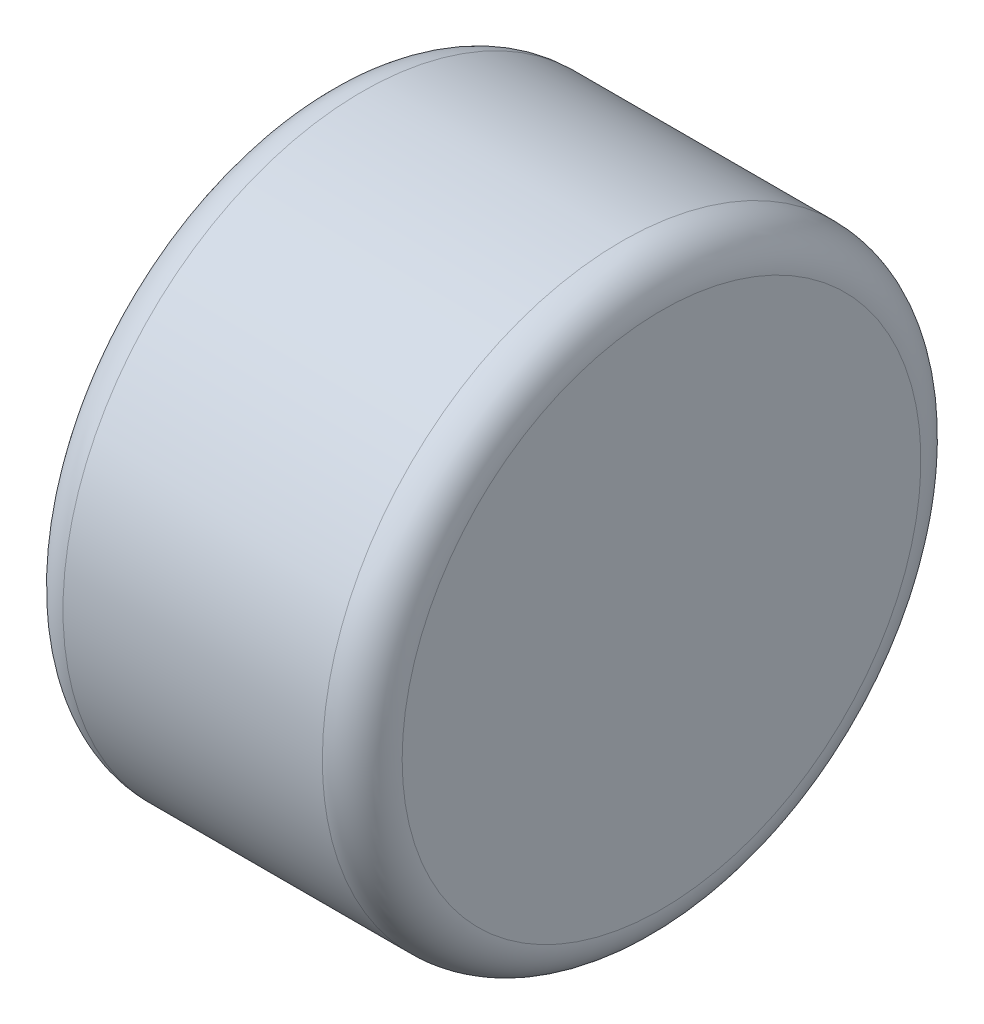
ISO-10303-21;
HEADER;
FILE_DESCRIPTION(('STEP AP214'),'2;1');
FILE_NAME('part.step','',(''),(''),'','','');
FILE_SCHEMA(('AUTOMOTIVE_DESIGN { 1 0 10303 214 1 1 1 1 }'));
ENDSEC;
DATA;
#1=APPLICATION_CONTEXT('core data for automotive mechanical design processes');
#2=APPLICATION_PROTOCOL_DEFINITION('international standard','automotive_design',2000,#1);
#3=PRODUCT_CONTEXT('',#1,'mechanical');
#4=PRODUCT('Part','Part','',(#3));
#5=PRODUCT_RELATED_PRODUCT_CATEGORY('part','',(#4));
#6=PRODUCT_DEFINITION_FORMATION('','',#4);
#7=PRODUCT_DEFINITION_CONTEXT('part definition',#1,'design');
#8=PRODUCT_DEFINITION('design','',#6,#7);
#9=PRODUCT_DEFINITION_SHAPE('','',#8);
#10=(LENGTH_UNIT() NAMED_UNIT(*) SI_UNIT(.MILLI.,.METRE.));
#11=(NAMED_UNIT(*) PLANE_ANGLE_UNIT() SI_UNIT($,.RADIAN.));
#12=(NAMED_UNIT(*) SI_UNIT($,.STERADIAN.) SOLID_ANGLE_UNIT());
#13=UNCERTAINTY_MEASURE_WITH_UNIT(LENGTH_MEASURE(1.E-05),#10,'distance_accuracy_value','');
#14=(GEOMETRIC_REPRESENTATION_CONTEXT(3) GLOBAL_UNCERTAINTY_ASSIGNED_CONTEXT((#13)) GLOBAL_UNIT_ASSIGNED_CONTEXT((#10,
#11,#12)) REPRESENTATION_CONTEXT('',''));
#15=CARTESIAN_POINT('',(0.,0.,0.));
#16=DIRECTION('',(0.,0.,1.));
#17=DIRECTION('',(1.,0.,0.));
#18=AXIS2_PLACEMENT_3D('',#15,#16,#17);
#19=CARTESIAN_POINT('',(-1.1999999165535,128.535533905933,85.025));
#20=DIRECTION('',(1.,0.,0.));
#21=DIRECTION('',(0.,1.,0.));
#22=AXIS2_PLACEMENT_3D('',#19,#20,#21);
#23=PLANE('',#22);
#24=CARTESIAN_POINT('',(-1.1999999165535,128.535533905933,85.));
#25=DIRECTION('',(-1.,0.,0.));
#26=DIRECTION('',(0.,-0.5,0.866025403784441));
#27=AXIS2_PLACEMENT_3D('',#24,#25,#26);
#28=CIRCLE('',#27,2.6);
#29=CARTESIAN_POINT('',(-1.1999999165535,128.535533905933,87.6));
#30=VERTEX_POINT('',#29);
#31=EDGE_CURVE('E28',#30,#30,#28,.T.);
#32=ORIENTED_EDGE('',*,*,#31,.F.);
#33=EDGE_LOOP('',(#32));
#34=FACE_BOUND('',#33,.T.);
#35=ADVANCED_FACE('F17',(#34),#23,.T.);
#36=CARTESIAN_POINT('',(-1.5999999165535,128.535533905933,85.));
#37=DIRECTION('',(1.,0.,0.));
#38=DIRECTION('',(0.,0.,-1.));
#39=AXIS2_PLACEMENT_3D('',#36,#37,#38);
#40=TOROIDAL_SURFACE('',#39,2.6,0.4);
#41=ORIENTED_EDGE('',*,*,#31,.T.);
#42=CARTESIAN_POINT('',(-1.5999999165535,128.535533905933,87.6));
#43=DIRECTION('',(0.,-1.,0.));
#44=DIRECTION('',(0.,0.,1.));
#45=AXIS2_PLACEMENT_3D('',#42,#43,#44);
#46=CIRCLE('',#45,0.4);
#47=CARTESIAN_POINT('',(-1.5999999165535,128.535533905933,88.));
#48=VERTEX_POINT('',#47);
#49=EDGE_CURVE('E11',#30,#48,#46,.T.);
#50=ORIENTED_EDGE('',*,*,#49,.T.);
#51=CARTESIAN_POINT('',(-1.5999999165535,128.535533905933,85.));
#52=DIRECTION('',(1.,0.,0.));
#53=DIRECTION('',(0.,-0.5,0.866025403784441));
#54=AXIS2_PLACEMENT_3D('',#51,#52,#53);
#55=CIRCLE('',#54,3.);
#56=CARTESIAN_POINT('',(-1.5999999165535,127.994550299375,87.9508196721311));
#57=VERTEX_POINT('',#56);
#58=EDGE_CURVE('E52',#48,#57,#55,.T.);
#59=ORIENTED_EDGE('',*,*,#58,.T.);
#60=CARTESIAN_POINT('',(-1.5999999165535,128.535533905933,85.));
#61=DIRECTION('',(1.,0.,0.));
#62=DIRECTION('',(0.,-0.5,0.866025403784441));
#63=AXIS2_PLACEMENT_3D('',#60,#61,#62);
#64=CIRCLE('',#63,3.);
#65=EDGE_CURVE('E21',#57,#48,#64,.T.);
#66=ORIENTED_EDGE('',*,*,#65,.T.);
#67=ORIENTED_EDGE('',*,*,#49,.F.);
#68=EDGE_LOOP('',(#41,#50,#59,#66,#67));
#69=FACE_BOUND('',#68,.T.);
#70=ADVANCED_FACE('F117',(#69),#40,.T.);
#71=CARTESIAN_POINT('',(-4.6,128.535533905933,85.025));
#72=DIRECTION('',(1.,0.,0.));
#73=DIRECTION('',(0.,1.,0.));
#74=AXIS2_PLACEMENT_3D('',#71,#72,#73);
#75=PLANE('',#74);
#76=CARTESIAN_POINT('',(-4.6,128.535533905933,85.));
#77=DIRECTION('',(1.,0.,0.));
#78=DIRECTION('',(0.,-0.5,0.866025403784441));
#79=AXIS2_PLACEMENT_3D('',#76,#77,#78);
#80=CIRCLE('',#79,2.6);
#81=CARTESIAN_POINT('',(-4.6,128.535533905933,82.4));
#82=VERTEX_POINT('',#81);
#83=EDGE_CURVE('E81',#82,#82,#80,.T.);
#84=ORIENTED_EDGE('',*,*,#83,.F.);
#85=EDGE_LOOP('',(#84));
#86=FACE_BOUND('',#85,.T.);
#87=ADVANCED_FACE('F112',(#86),#75,.F.);
#88=CARTESIAN_POINT('',(-4.6,128.535533905933,85.));
#89=DIRECTION('',(1.,0.,0.));
#90=DIRECTION('',(0.,0.180327868852446,-0.983606557377051));
#91=AXIS2_PLACEMENT_3D('',#88,#89,#90);
#92=CYLINDRICAL_SURFACE('',#91,3.);
#93=ORIENTED_EDGE('',*,*,#65,.F.);
#94=DIRECTION('',(-1.,0.,0.));
#95=VECTOR('',#94,1.);
#96=CARTESIAN_POINT('',(-4.6,127.994550299375,87.9508196721311));
#97=LINE('',#96,#95);
#98=CARTESIAN_POINT('',(-4.2,127.994550299375,87.9508196721311));
#99=VERTEX_POINT('',#98);
#100=EDGE_CURVE('E60',#57,#99,#97,.T.);
#101=ORIENTED_EDGE('',*,*,#100,.T.);
#102=CARTESIAN_POINT('',(-4.2,128.535533905933,85.));
#103=DIRECTION('',(-1.,0.,0.));
#104=DIRECTION('',(0.,-0.5,0.866025403784441));
#105=AXIS2_PLACEMENT_3D('',#102,#103,#104);
#106=CIRCLE('',#105,3.);
#107=CARTESIAN_POINT('',(-4.2,128.535533905933,82.));
#108=VERTEX_POINT('',#107);
#109=EDGE_CURVE('E64',#108,#99,#106,.T.);
#110=ORIENTED_EDGE('',*,*,#109,.F.);
#111=CARTESIAN_POINT('',(-4.2,128.535533905933,85.));
#112=DIRECTION('',(-1.,0.,0.));
#113=DIRECTION('',(0.,-0.5,0.866025403784441));
#114=AXIS2_PLACEMENT_3D('',#111,#112,#113);
#115=CIRCLE('',#114,3.);
#116=EDGE_CURVE('E68',#99,#108,#115,.T.);
#117=ORIENTED_EDGE('',*,*,#116,.F.);
#118=ORIENTED_EDGE('',*,*,#100,.F.);
#119=ORIENTED_EDGE('',*,*,#58,.F.);
#120=EDGE_LOOP('',(#93,#101,#110,#117,#118,#119));
#121=FACE_BOUND('',#120,.T.);
#122=ADVANCED_FACE('F62',(#121),#92,.T.);
#123=CARTESIAN_POINT('',(-4.2,128.535533905933,85.));
#124=DIRECTION('',(-1.,0.,0.));
#125=DIRECTION('',(0.,0.,1.));
#126=AXIS2_PLACEMENT_3D('',#123,#124,#125);
#127=TOROIDAL_SURFACE('',#126,2.6,0.4);
#128=ORIENTED_EDGE('',*,*,#83,.T.);
#129=CARTESIAN_POINT('',(-4.2,128.535533905933,82.4));
#130=DIRECTION('',(0.,-1.,0.));
#131=DIRECTION('',(0.,0.,-1.));
#132=AXIS2_PLACEMENT_3D('',#129,#130,#131);
#133=CIRCLE('',#132,0.4);
#134=EDGE_CURVE('E74',#82,#108,#133,.T.);
#135=ORIENTED_EDGE('',*,*,#134,.T.);
#136=ORIENTED_EDGE('',*,*,#109,.T.);
#137=ORIENTED_EDGE('',*,*,#116,.T.);
#138=ORIENTED_EDGE('',*,*,#134,.F.);
#139=EDGE_LOOP('',(#128,#135,#136,#137,#138));
#140=FACE_BOUND('',#139,.T.);
#141=ADVANCED_FACE('F19',(#140),#127,.T.);
#142=CLOSED_SHELL('',(#35,#70,#87,#122,#141));
#143=MANIFOLD_SOLID_BREP('B1',#142);
#144=ADVANCED_BREP_SHAPE_REPRESENTATION('',(#18,#143),#14);
#145=SHAPE_DEFINITION_REPRESENTATION(#9,#144);
ENDSEC;
END-ISO-10303-21;
